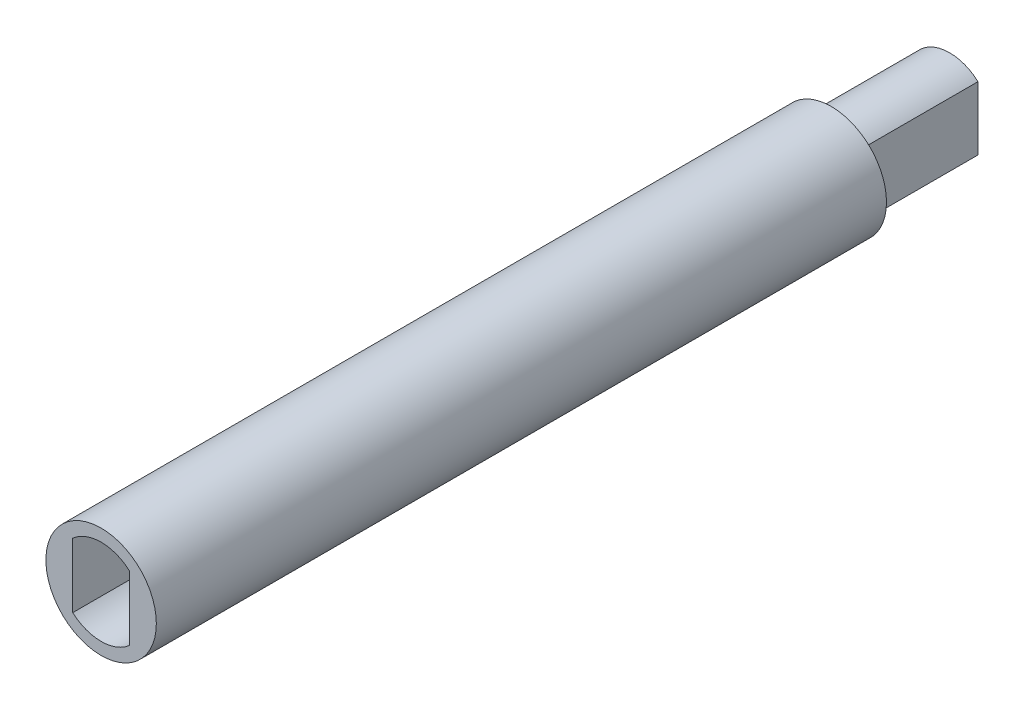
ISO-10303-21;
HEADER;
FILE_DESCRIPTION(('STEP AP214'),'2;1');
FILE_NAME('part.step','',(''),(''),'','','');
FILE_SCHEMA(('AUTOMOTIVE_DESIGN { 1 0 10303 214 1 1 1 1 }'));
ENDSEC;
DATA;
#1=APPLICATION_CONTEXT('core data for automotive mechanical design processes');
#2=APPLICATION_PROTOCOL_DEFINITION('international standard','automotive_design',2000,#1);
#3=PRODUCT_CONTEXT('',#1,'mechanical');
#4=PRODUCT('Part','Part','',(#3));
#5=PRODUCT_RELATED_PRODUCT_CATEGORY('part','',(#4));
#6=PRODUCT_DEFINITION_FORMATION('','',#4);
#7=PRODUCT_DEFINITION_CONTEXT('part definition',#1,'design');
#8=PRODUCT_DEFINITION('design','',#6,#7);
#9=PRODUCT_DEFINITION_SHAPE('','',#8);
#10=(LENGTH_UNIT() NAMED_UNIT(*) SI_UNIT(.MILLI.,.METRE.));
#11=(NAMED_UNIT(*) PLANE_ANGLE_UNIT() SI_UNIT($,.RADIAN.));
#12=(NAMED_UNIT(*) SI_UNIT($,.STERADIAN.) SOLID_ANGLE_UNIT());
#13=UNCERTAINTY_MEASURE_WITH_UNIT(LENGTH_MEASURE(1.E-05),#10,'distance_accuracy_value','');
#14=(GEOMETRIC_REPRESENTATION_CONTEXT(3) GLOBAL_UNCERTAINTY_ASSIGNED_CONTEXT((#13)) GLOBAL_UNIT_ASSIGNED_CONTEXT((#10,
#11,#12)) REPRESENTATION_CONTEXT('',''));
#15=CARTESIAN_POINT('',(0.,0.,0.));
#16=DIRECTION('',(0.,0.,1.));
#17=DIRECTION('',(1.,0.,0.));
#18=AXIS2_PLACEMENT_3D('',#15,#16,#17);
#19=CARTESIAN_POINT('',(0.,0.,-65.5));
#20=DIRECTION('',(0.,0.,1.));
#21=DIRECTION('',(1.,0.,0.));
#22=AXIS2_PLACEMENT_3D('',#19,#20,#21);
#23=CYLINDRICAL_SURFACE('',#22,3.5);
#24=CARTESIAN_POINT('',(0.,0.,-45.5));
#25=DIRECTION('',(0.,0.,-1.));
#26=DIRECTION('',(-1.,0.,0.));
#27=AXIS2_PLACEMENT_3D('',#24,#25,#26);
#28=CIRCLE('',#27,3.5);
#29=CARTESIAN_POINT('',(-3.5,0.,-45.5));
#30=VERTEX_POINT('',#29);
#31=EDGE_CURVE('E149',#30,#30,#28,.T.);
#32=ORIENTED_EDGE('',*,*,#31,.F.);
#33=EDGE_LOOP('',(#32));
#34=FACE_BOUND('',#33,.T.);
#35=CARTESIAN_POINT('',(0.,0.,0.78));
#36=DIRECTION('',(0.,0.,1.));
#37=DIRECTION('',(1.,0.,0.));
#38=AXIS2_PLACEMENT_3D('',#35,#36,#37);
#39=CIRCLE('',#38,3.5);
#40=CARTESIAN_POINT('',(3.5,0.,0.78));
#41=VERTEX_POINT('',#40);
#42=EDGE_CURVE('E112',#41,#41,#39,.T.);
#43=ORIENTED_EDGE('',*,*,#42,.F.);
#44=EDGE_LOOP('',(#43));
#45=FACE_BOUND('',#44,.T.);
#46=ADVANCED_FACE('F39',(#34,#45),#23,.T.);
#47=CARTESIAN_POINT('',(-1.8,0.,-45.5));
#48=DIRECTION('',(1.,0.,0.));
#49=DIRECTION('',(0.,0.,-1.));
#50=AXIS2_PLACEMENT_3D('',#47,#48,#49);
#51=PLANE('',#50);
#52=DIRECTION('',(0.,1.,0.));
#53=VECTOR('',#52,1.);
#54=CARTESIAN_POINT('',(-1.8,4.20472197600874,-53.));
#55=LINE('',#54,#53);
#56=CARTESIAN_POINT('',(-1.8,-2.01246117974981,-53.));
#57=VERTEX_POINT('',#56);
#58=CARTESIAN_POINT('',(-1.8,2.01246117974981,-53.));
#59=VERTEX_POINT('',#58);
#60=EDGE_CURVE('E169',#57,#59,#55,.T.);
#61=ORIENTED_EDGE('',*,*,#60,.F.);
#62=DIRECTION('',(0.,0.,-1.));
#63=VECTOR('',#62,1.);
#64=CARTESIAN_POINT('',(-1.8,-2.01246117974981,-45.5));
#65=LINE('',#64,#63);
#66=CARTESIAN_POINT('',(-1.8,-2.01246117974981,-45.5));
#67=VERTEX_POINT('',#66);
#68=EDGE_CURVE('E143',#67,#57,#65,.T.);
#69=ORIENTED_EDGE('',*,*,#68,.F.);
#70=DIRECTION('',(0.,-1.,0.));
#71=VECTOR('',#70,1.);
#72=CARTESIAN_POINT('',(-1.8,0.,-45.5));
#73=LINE('',#72,#71);
#74=CARTESIAN_POINT('',(-1.8,2.01246117974981,-45.5));
#75=VERTEX_POINT('',#74);
#76=EDGE_CURVE('E158',#75,#67,#73,.T.);
#77=ORIENTED_EDGE('',*,*,#76,.F.);
#78=DIRECTION('',(0.,0.,-1.));
#79=VECTOR('',#78,1.);
#80=CARTESIAN_POINT('',(-1.8,2.01246117974981,-45.5));
#81=LINE('',#80,#79);
#82=EDGE_CURVE('E145',#75,#59,#81,.T.);
#83=ORIENTED_EDGE('',*,*,#82,.T.);
#84=EDGE_LOOP('',(#61,#69,#77,#83));
#85=FACE_BOUND('',#84,.T.);
#86=ADVANCED_FACE('F178',(#85),#51,.F.);
#87=CARTESIAN_POINT('',(0.,0.,-45.5));
#88=DIRECTION('',(0.,0.,-1.));
#89=DIRECTION('',(-1.,0.,0.));
#90=AXIS2_PLACEMENT_3D('',#87,#88,#89);
#91=CYLINDRICAL_SURFACE('',#90,2.7);
#92=CARTESIAN_POINT('',(0.,0.,-53.));
#93=DIRECTION('',(0.,0.,1.));
#94=DIRECTION('',(1.,0.,0.));
#95=AXIS2_PLACEMENT_3D('',#92,#93,#94);
#96=CIRCLE('',#95,2.7);
#97=CARTESIAN_POINT('',(1.8,2.01246117974981,-53.));
#98=VERTEX_POINT('',#97);
#99=EDGE_CURVE('E168',#59,#98,#96,.F.);
#100=ORIENTED_EDGE('',*,*,#99,.F.);
#101=ORIENTED_EDGE('',*,*,#82,.F.);
#102=CARTESIAN_POINT('',(0.,0.,-45.5));
#103=DIRECTION('',(0.,0.,-1.));
#104=DIRECTION('',(-1.,0.,0.));
#105=AXIS2_PLACEMENT_3D('',#102,#103,#104);
#106=CIRCLE('',#105,2.7);
#107=CARTESIAN_POINT('',(1.8,2.01246117974981,-45.5));
#108=VERTEX_POINT('',#107);
#109=EDGE_CURVE('E161',#75,#108,#106,.T.);
#110=ORIENTED_EDGE('',*,*,#109,.T.);
#111=DIRECTION('',(0.,0.,-1.));
#112=VECTOR('',#111,1.);
#113=CARTESIAN_POINT('',(1.8,2.01246117974981,-45.5));
#114=LINE('',#113,#112);
#115=EDGE_CURVE('E142',#108,#98,#114,.T.);
#116=ORIENTED_EDGE('',*,*,#115,.T.);
#117=EDGE_LOOP('',(#100,#101,#110,#116));
#118=FACE_BOUND('',#117,.T.);
#119=ADVANCED_FACE('F184',(#118),#91,.T.);
#120=CARTESIAN_POINT('',(1.8,0.,-45.5));
#121=DIRECTION('',(1.,0.,0.));
#122=DIRECTION('',(0.,0.,-1.));
#123=AXIS2_PLACEMENT_3D('',#120,#121,#122);
#124=PLANE('',#123);
#125=DIRECTION('',(0.,-1.,0.));
#126=VECTOR('',#125,1.);
#127=CARTESIAN_POINT('',(1.8,0.,-53.));
#128=LINE('',#127,#126);
#129=CARTESIAN_POINT('',(1.8,-2.01246117974981,-53.));
#130=VERTEX_POINT('',#129);
#131=EDGE_CURVE('E58',#98,#130,#128,.T.);
#132=ORIENTED_EDGE('',*,*,#131,.F.);
#133=ORIENTED_EDGE('',*,*,#115,.F.);
#134=DIRECTION('',(0.,-1.,0.));
#135=VECTOR('',#134,1.);
#136=CARTESIAN_POINT('',(1.8,0.,-45.5));
#137=LINE('',#136,#135);
#138=CARTESIAN_POINT('',(1.8,-2.01246117974981,-45.5));
#139=VERTEX_POINT('',#138);
#140=EDGE_CURVE('E157',#108,#139,#137,.T.);
#141=ORIENTED_EDGE('',*,*,#140,.T.);
#142=DIRECTION('',(0.,0.,-1.));
#143=VECTOR('',#142,1.);
#144=CARTESIAN_POINT('',(1.8,-2.01246117974981,-45.5));
#145=LINE('',#144,#143);
#146=EDGE_CURVE('E148',#139,#130,#145,.T.);
#147=ORIENTED_EDGE('',*,*,#146,.T.);
#148=EDGE_LOOP('',(#132,#133,#141,#147));
#149=FACE_BOUND('',#148,.T.);
#150=ADVANCED_FACE('F202',(#149),#124,.T.);
#151=CARTESIAN_POINT('',(0.,0.,-45.5));
#152=DIRECTION('',(0.,0.,-1.));
#153=DIRECTION('',(-1.,0.,0.));
#154=AXIS2_PLACEMENT_3D('',#151,#152,#153);
#155=CYLINDRICAL_SURFACE('',#154,2.7);
#156=CARTESIAN_POINT('',(0.,0.,-53.));
#157=DIRECTION('',(0.,0.,1.));
#158=DIRECTION('',(1.,0.,0.));
#159=AXIS2_PLACEMENT_3D('',#156,#157,#158);
#160=CIRCLE('',#159,2.7);
#161=EDGE_CURVE('E46',#130,#57,#160,.F.);
#162=ORIENTED_EDGE('',*,*,#161,.F.);
#163=ORIENTED_EDGE('',*,*,#146,.F.);
#164=CARTESIAN_POINT('',(0.,0.,-45.5));
#165=DIRECTION('',(0.,0.,-1.));
#166=DIRECTION('',(-1.,0.,0.));
#167=AXIS2_PLACEMENT_3D('',#164,#165,#166);
#168=CIRCLE('',#167,2.7);
#169=EDGE_CURVE('E159',#139,#67,#168,.T.);
#170=ORIENTED_EDGE('',*,*,#169,.T.);
#171=ORIENTED_EDGE('',*,*,#68,.T.);
#172=EDGE_LOOP('',(#162,#163,#170,#171));
#173=FACE_BOUND('',#172,.T.);
#174=ADVANCED_FACE('F195',(#173),#155,.T.);
#175=CARTESIAN_POINT('',(0.,0.,-45.5));
#176=DIRECTION('',(0.,0.,-1.));
#177=DIRECTION('',(-1.,0.,0.));
#178=AXIS2_PLACEMENT_3D('',#175,#176,#177);
#179=PLANE('',#178);
#180=ORIENTED_EDGE('',*,*,#109,.F.);
#181=ORIENTED_EDGE('',*,*,#76,.T.);
#182=ORIENTED_EDGE('',*,*,#169,.F.);
#183=ORIENTED_EDGE('',*,*,#140,.F.);
#184=EDGE_LOOP('',(#180,#181,#182,#183));
#185=FACE_BOUND('',#184,.T.);
#186=ORIENTED_EDGE('',*,*,#31,.T.);
#187=EDGE_LOOP('',(#186));
#188=FACE_BOUND('',#187,.T.);
#189=ADVANCED_FACE('F188',(#185,#188),#179,.T.);
#190=CARTESIAN_POINT('',(8.2,4.20472197600874,-53.));
#191=DIRECTION('',(0.,0.,1.));
#192=DIRECTION('',(1.,0.,0.));
#193=AXIS2_PLACEMENT_3D('',#190,#191,#192);
#194=PLANE('',#193);
#195=ORIENTED_EDGE('',*,*,#99,.T.);
#196=ORIENTED_EDGE('',*,*,#131,.T.);
#197=ORIENTED_EDGE('',*,*,#161,.T.);
#198=ORIENTED_EDGE('',*,*,#60,.T.);
#199=EDGE_LOOP('',(#195,#196,#197,#198));
#200=FACE_BOUND('',#199,.T.);
#201=ADVANCED_FACE('F191',(#200),#194,.F.);
#202=CARTESIAN_POINT('',(0.,0.,0.78));
#203=DIRECTION('',(0.,0.,1.));
#204=DIRECTION('',(1.,0.,0.));
#205=AXIS2_PLACEMENT_3D('',#202,#203,#204);
#206=PLANE('',#205);
#207=ORIENTED_EDGE('',*,*,#42,.T.);
#208=EDGE_LOOP('',(#207));
#209=FACE_BOUND('',#208,.T.);
#210=DIRECTION('',(0.,-1.,0.));
#211=VECTOR('',#210,1.);
#212=CARTESIAN_POINT('',(1.8,2.04588000625648,0.779999999999999));
#213=LINE('',#212,#211);
#214=CARTESIAN_POINT('',(1.8,2.04588000625648,0.779999999999999));
#215=VERTEX_POINT('',#214);
#216=CARTESIAN_POINT('',(1.8,-2.04588000625648,0.779999999999999));
#217=VERTEX_POINT('',#216);
#218=EDGE_CURVE('E55',#215,#217,#213,.T.);
#219=ORIENTED_EDGE('',*,*,#218,.T.);
#220=CARTESIAN_POINT('',(0.,0.,0.779999999999999));
#221=DIRECTION('',(0.,0.,1.));
#222=DIRECTION('',(1.,0.,0.));
#223=AXIS2_PLACEMENT_3D('',#220,#221,#222);
#224=CIRCLE('',#223,2.725);
#225=CARTESIAN_POINT('',(-1.8,-2.04588000625648,0.779999999999999));
#226=VERTEX_POINT('',#225);
#227=EDGE_CURVE('E11',#217,#226,#224,.F.);
#228=ORIENTED_EDGE('',*,*,#227,.T.);
#229=DIRECTION('',(0.,1.,0.));
#230=VECTOR('',#229,1.);
#231=CARTESIAN_POINT('',(-1.8,2.04588000625648,0.779999999999999));
#232=LINE('',#231,#230);
#233=CARTESIAN_POINT('',(-1.8,2.04588000625648,0.779999999999999));
#234=VERTEX_POINT('',#233);
#235=EDGE_CURVE('E103',#226,#234,#232,.T.);
#236=ORIENTED_EDGE('',*,*,#235,.T.);
#237=CARTESIAN_POINT('',(0.,0.,0.779999999999999));
#238=DIRECTION('',(0.,0.,1.));
#239=DIRECTION('',(1.,0.,0.));
#240=AXIS2_PLACEMENT_3D('',#237,#238,#239);
#241=CIRCLE('',#240,2.725);
#242=EDGE_CURVE('E113',#234,#215,#241,.F.);
#243=ORIENTED_EDGE('',*,*,#242,.T.);
#244=EDGE_LOOP('',(#219,#228,#236,#243));
#245=FACE_BOUND('',#244,.T.);
#246=ADVANCED_FACE('F99',(#209,#245),#206,.T.);
#247=CARTESIAN_POINT('',(0.,0.,-8.));
#248=DIRECTION('',(0.,0.,1.));
#249=DIRECTION('',(1.,0.,0.));
#250=AXIS2_PLACEMENT_3D('',#247,#248,#249);
#251=PLANE('',#250);
#252=CARTESIAN_POINT('',(0.,0.,-8.));
#253=DIRECTION('',(0.,0.,1.));
#254=DIRECTION('',(1.,0.,0.));
#255=AXIS2_PLACEMENT_3D('',#252,#253,#254);
#256=CIRCLE('',#255,2.725);
#257=CARTESIAN_POINT('',(-1.8,-2.04588000625648,-8.));
#258=VERTEX_POINT('',#257);
#259=CARTESIAN_POINT('',(1.8,-2.04588000625648,-8.));
#260=VERTEX_POINT('',#259);
#261=EDGE_CURVE('E117',#258,#260,#256,.T.);
#262=ORIENTED_EDGE('',*,*,#261,.T.);
#263=DIRECTION('',(0.,1.,0.));
#264=VECTOR('',#263,1.);
#265=CARTESIAN_POINT('',(1.8,2.04588000625648,-8.));
#266=LINE('',#265,#264);
#267=CARTESIAN_POINT('',(1.8,2.04588000625648,-8.));
#268=VERTEX_POINT('',#267);
#269=EDGE_CURVE('E133',#260,#268,#266,.T.);
#270=ORIENTED_EDGE('',*,*,#269,.T.);
#271=CARTESIAN_POINT('',(0.,0.,-8.));
#272=DIRECTION('',(0.,0.,1.));
#273=DIRECTION('',(1.,0.,0.));
#274=AXIS2_PLACEMENT_3D('',#271,#272,#273);
#275=CIRCLE('',#274,2.725);
#276=CARTESIAN_POINT('',(-1.8,2.04588000625648,-8.));
#277=VERTEX_POINT('',#276);
#278=EDGE_CURVE('E135',#268,#277,#275,.T.);
#279=ORIENTED_EDGE('',*,*,#278,.T.);
#280=DIRECTION('',(0.,-1.,0.));
#281=VECTOR('',#280,1.);
#282=CARTESIAN_POINT('',(-1.8,2.04588000625648,-8.));
#283=LINE('',#282,#281);
#284=EDGE_CURVE('E121',#277,#258,#283,.T.);
#285=ORIENTED_EDGE('',*,*,#284,.T.);
#286=EDGE_LOOP('',(#262,#270,#279,#285));
#287=FACE_BOUND('',#286,.T.);
#288=ADVANCED_FACE('F215',(#287),#251,.T.);
#289=CARTESIAN_POINT('',(0.,0.,-8.));
#290=DIRECTION('',(0.,0.,1.));
#291=DIRECTION('',(1.,0.,0.));
#292=AXIS2_PLACEMENT_3D('',#289,#290,#291);
#293=CYLINDRICAL_SURFACE('',#292,2.725);
#294=ORIENTED_EDGE('',*,*,#227,.F.);
#295=DIRECTION('',(0.,0.,1.));
#296=VECTOR('',#295,1.);
#297=CARTESIAN_POINT('',(1.8,-2.04588000625648,-8.));
#298=LINE('',#297,#296);
#299=EDGE_CURVE('E128',#260,#217,#298,.T.);
#300=ORIENTED_EDGE('',*,*,#299,.F.);
#301=ORIENTED_EDGE('',*,*,#261,.F.);
#302=DIRECTION('',(0.,0.,1.));
#303=VECTOR('',#302,1.);
#304=CARTESIAN_POINT('',(-1.8,-2.04588000625648,-8.));
#305=LINE('',#304,#303);
#306=EDGE_CURVE('E109',#258,#226,#305,.T.);
#307=ORIENTED_EDGE('',*,*,#306,.T.);
#308=EDGE_LOOP('',(#294,#300,#301,#307));
#309=FACE_BOUND('',#308,.T.);
#310=ADVANCED_FACE('F116',(#309),#293,.F.);
#311=CARTESIAN_POINT('',(-1.8,2.04588000625648,-8.));
#312=DIRECTION('',(-1.,0.,0.));
#313=DIRECTION('',(0.,0.,1.));
#314=AXIS2_PLACEMENT_3D('',#311,#312,#313);
#315=PLANE('',#314);
#316=ORIENTED_EDGE('',*,*,#235,.F.);
#317=ORIENTED_EDGE('',*,*,#306,.F.);
#318=ORIENTED_EDGE('',*,*,#284,.F.);
#319=DIRECTION('',(0.,0.,1.));
#320=VECTOR('',#319,1.);
#321=CARTESIAN_POINT('',(-1.8,2.04588000625648,-8.));
#322=LINE('',#321,#320);
#323=EDGE_CURVE('E115',#277,#234,#322,.T.);
#324=ORIENTED_EDGE('',*,*,#323,.T.);
#325=EDGE_LOOP('',(#316,#317,#318,#324));
#326=FACE_BOUND('',#325,.T.);
#327=ADVANCED_FACE('F108',(#326),#315,.F.);
#328=CARTESIAN_POINT('',(0.,0.,-8.));
#329=DIRECTION('',(0.,0.,1.));
#330=DIRECTION('',(1.,0.,0.));
#331=AXIS2_PLACEMENT_3D('',#328,#329,#330);
#332=CYLINDRICAL_SURFACE('',#331,2.725);
#333=ORIENTED_EDGE('',*,*,#242,.F.);
#334=ORIENTED_EDGE('',*,*,#323,.F.);
#335=ORIENTED_EDGE('',*,*,#278,.F.);
#336=DIRECTION('',(0.,0.,1.));
#337=VECTOR('',#336,1.);
#338=CARTESIAN_POINT('',(1.8,2.04588000625648,-8.));
#339=LINE('',#338,#337);
#340=EDGE_CURVE('E122',#268,#215,#339,.T.);
#341=ORIENTED_EDGE('',*,*,#340,.T.);
#342=EDGE_LOOP('',(#333,#334,#335,#341));
#343=FACE_BOUND('',#342,.T.);
#344=ADVANCED_FACE('F220',(#343),#332,.F.);
#345=CARTESIAN_POINT('',(1.8,2.04588000625648,-8.));
#346=DIRECTION('',(1.,0.,0.));
#347=DIRECTION('',(0.,0.,-1.));
#348=AXIS2_PLACEMENT_3D('',#345,#346,#347);
#349=PLANE('',#348);
#350=ORIENTED_EDGE('',*,*,#218,.F.);
#351=ORIENTED_EDGE('',*,*,#340,.F.);
#352=ORIENTED_EDGE('',*,*,#269,.F.);
#353=ORIENTED_EDGE('',*,*,#299,.T.);
#354=EDGE_LOOP('',(#350,#351,#352,#353));
#355=FACE_BOUND('',#354,.T.);
#356=ADVANCED_FACE('F218',(#355),#349,.F.);
#357=CLOSED_SHELL('',(#46,#86,#119,#150,#174,#189,#201,#246,#288,#310,#327,#344,#356));
#358=MANIFOLD_SOLID_BREP('B2',#357);
#359=ADVANCED_BREP_SHAPE_REPRESENTATION('',(#18,#358),#14);
#360=SHAPE_DEFINITION_REPRESENTATION(#9,#359);
ENDSEC;
END-ISO-10303-21;
